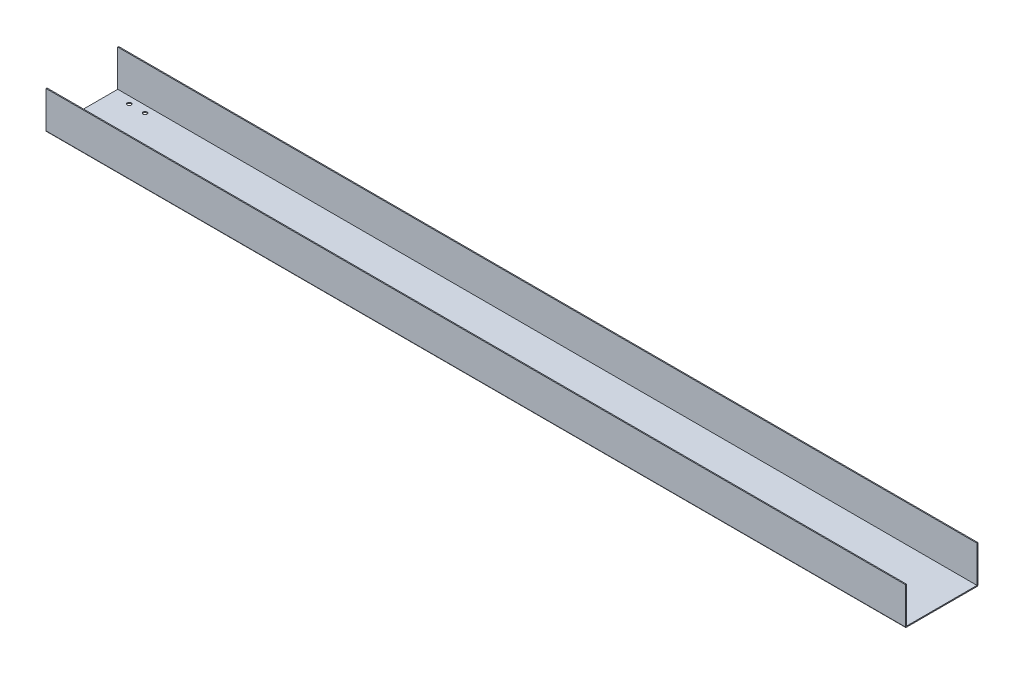
ISO-10303-21;
HEADER;
FILE_DESCRIPTION(('STEP AP214'),'2;1');
FILE_NAME('part.step','',(''),(''),'','','');
FILE_SCHEMA(('AUTOMOTIVE_DESIGN { 1 0 10303 214 1 1 1 1 }'));
ENDSEC;
DATA;
#1=APPLICATION_CONTEXT('core data for automotive mechanical design processes');
#2=APPLICATION_PROTOCOL_DEFINITION('international standard','automotive_design',2000,#1);
#3=PRODUCT_CONTEXT('',#1,'mechanical');
#4=PRODUCT('Part','Part','',(#3));
#5=PRODUCT_RELATED_PRODUCT_CATEGORY('part','',(#4));
#6=PRODUCT_DEFINITION_FORMATION('','',#4);
#7=PRODUCT_DEFINITION_CONTEXT('part definition',#1,'design');
#8=PRODUCT_DEFINITION('design','',#6,#7);
#9=PRODUCT_DEFINITION_SHAPE('','',#8);
#10=(LENGTH_UNIT() NAMED_UNIT(*) SI_UNIT(.MILLI.,.METRE.));
#11=(NAMED_UNIT(*) PLANE_ANGLE_UNIT() SI_UNIT($,.RADIAN.));
#12=(NAMED_UNIT(*) SI_UNIT($,.STERADIAN.) SOLID_ANGLE_UNIT());
#13=UNCERTAINTY_MEASURE_WITH_UNIT(LENGTH_MEASURE(1.E-05),#10,'distance_accuracy_value','');
#14=(GEOMETRIC_REPRESENTATION_CONTEXT(3) GLOBAL_UNCERTAINTY_ASSIGNED_CONTEXT((#13)) GLOBAL_UNIT_ASSIGNED_CONTEXT((#10,
#11,#12)) REPRESENTATION_CONTEXT('',''));
#15=CARTESIAN_POINT('',(0.,0.,0.));
#16=DIRECTION('',(0.,0.,1.));
#17=DIRECTION('',(1.,0.,0.));
#18=AXIS2_PLACEMENT_3D('',#15,#16,#17);
#19=CARTESIAN_POINT('',(-592.530487804878,-1.5,-96.6082317073171));
#20=DIRECTION('',(-1.,0.,0.));
#21=DIRECTION('',(0.,0.,1.));
#22=AXIS2_PLACEMENT_3D('',#19,#20,#21);
#23=PLANE('',#22);
#24=DIRECTION('',(0.,0.,1.));
#25=VECTOR('',#24,1.);
#26=CARTESIAN_POINT('',(-592.530487804878,-1.5,-96.6082317073171));
#27=LINE('',#26,#25);
#28=CARTESIAN_POINT('',(-592.530487804878,-1.5,-40.1082317073171));
#29=VERTEX_POINT('',#28);
#30=CARTESIAN_POINT('',(-592.530487804878,-1.5,66.891768292683));
#31=VERTEX_POINT('',#30);
#32=EDGE_CURVE('E216',#29,#31,#27,.T.);
#33=ORIENTED_EDGE('',*,*,#32,.T.);
#34=DIRECTION('',(0.,1.,0.));
#35=VECTOR('',#34,1.);
#36=CARTESIAN_POINT('',(-592.530487804878,-1.49999999999999,66.891768292683));
#37=LINE('',#36,#35);
#38=CARTESIAN_POINT('',(-592.530487804878,0.,66.891768292683));
#39=VERTEX_POINT('',#38);
#40=EDGE_CURVE('E210',#31,#39,#37,.T.);
#41=ORIENTED_EDGE('',*,*,#40,.T.);
#42=DIRECTION('',(0.,0.,1.));
#43=VECTOR('',#42,1.);
#44=CARTESIAN_POINT('',(-592.530487804878,0.,-96.6082317073171));
#45=LINE('',#44,#43);
#46=CARTESIAN_POINT('',(-592.530487804878,0.,-40.1082317073171));
#47=VERTEX_POINT('',#46);
#48=EDGE_CURVE('E195',#47,#39,#45,.T.);
#49=ORIENTED_EDGE('',*,*,#48,.F.);
#50=DIRECTION('',(0.,-1.,0.));
#51=VECTOR('',#50,1.);
#52=CARTESIAN_POINT('',(-592.530487804878,-1.5,-40.1082317073171));
#53=LINE('',#52,#51);
#54=EDGE_CURVE('E204',#47,#29,#53,.T.);
#55=ORIENTED_EDGE('',*,*,#54,.T.);
#56=EDGE_LOOP('',(#33,#41,#49,#55));
#57=FACE_BOUND('',#56,.T.);
#58=ADVANCED_FACE('F46',(#57),#23,.T.);
#59=CARTESIAN_POINT('',(707.469512195122,-1.5,-96.6082317073171));
#60=DIRECTION('',(1.,0.,0.));
#61=DIRECTION('',(0.,0.,-1.));
#62=AXIS2_PLACEMENT_3D('',#59,#60,#61);
#63=PLANE('',#62);
#64=DIRECTION('',(0.,0.,-1.));
#65=VECTOR('',#64,1.);
#66=CARTESIAN_POINT('',(707.469512195122,0.,-96.6082317073171));
#67=LINE('',#66,#65);
#68=CARTESIAN_POINT('',(707.469512195122,0.,66.8917682926829));
#69=VERTEX_POINT('',#68);
#70=CARTESIAN_POINT('',(707.469512195122,0.,-40.1082317073171));
#71=VERTEX_POINT('',#70);
#72=EDGE_CURVE('E219',#69,#71,#67,.T.);
#73=ORIENTED_EDGE('',*,*,#72,.F.);
#74=DIRECTION('',(0.,-1.,0.));
#75=VECTOR('',#74,1.);
#76=CARTESIAN_POINT('',(707.469512195122,-1.49999999999999,66.8917682926829));
#77=LINE('',#76,#75);
#78=CARTESIAN_POINT('',(707.469512195122,-1.5,66.891768292683));
#79=VERTEX_POINT('',#78);
#80=EDGE_CURVE('E12',#69,#79,#77,.T.);
#81=ORIENTED_EDGE('',*,*,#80,.T.);
#82=DIRECTION('',(0.,0.,-1.));
#83=VECTOR('',#82,1.);
#84=CARTESIAN_POINT('',(707.469512195122,-1.5,-96.6082317073171));
#85=LINE('',#84,#83);
#86=CARTESIAN_POINT('',(707.469512195122,-1.5,-40.1082317073171));
#87=VERTEX_POINT('',#86);
#88=EDGE_CURVE('E200',#79,#87,#85,.T.);
#89=ORIENTED_EDGE('',*,*,#88,.T.);
#90=DIRECTION('',(0.,1.,0.));
#91=VECTOR('',#90,1.);
#92=CARTESIAN_POINT('',(707.469512195122,-1.5,-40.1082317073171));
#93=LINE('',#92,#91);
#94=EDGE_CURVE('E199',#87,#71,#93,.T.);
#95=ORIENTED_EDGE('',*,*,#94,.T.);
#96=EDGE_LOOP('',(#73,#81,#89,#95));
#97=FACE_BOUND('',#96,.T.);
#98=ADVANCED_FACE('F48',(#97),#63,.T.);
#99=CARTESIAN_POINT('',(0.,0.,0.));
#100=DIRECTION('',(0.,1.,0.));
#101=DIRECTION('',(0.,0.,1.));
#102=AXIS2_PLACEMENT_3D('',#99,#100,#101);
#103=PLANE('',#102);
#104=CARTESIAN_POINT('',(-564.580402517152,0.,-29.608231707317));
#105=DIRECTION('',(0.,1.,0.));
#106=DIRECTION('',(0.,0.,1.));
#107=AXIS2_PLACEMENT_3D('',#104,#105,#106);
#108=CIRCLE('',#107,3.00000000000005);
#109=CARTESIAN_POINT('',(-564.580402517152,0.,-26.6082317073169));
#110=VERTEX_POINT('',#109);
#111=EDGE_CURVE('E242',#110,#110,#108,.T.);
#112=ORIENTED_EDGE('',*,*,#111,.F.);
#113=EDGE_LOOP('',(#112));
#114=FACE_BOUND('',#113,.T.);
#115=CARTESIAN_POINT('',(-540.580402517152,0.,-29.608231707317));
#116=DIRECTION('',(0.,1.,0.));
#117=DIRECTION('',(0.,0.,1.));
#118=AXIS2_PLACEMENT_3D('',#115,#116,#117);
#119=CIRCLE('',#118,3.00000000000005);
#120=CARTESIAN_POINT('',(-540.580402517152,0.,-26.6082317073169));
#121=VERTEX_POINT('',#120);
#122=EDGE_CURVE('E232',#121,#121,#119,.T.);
#123=ORIENTED_EDGE('',*,*,#122,.F.);
#124=EDGE_LOOP('',(#123));
#125=FACE_BOUND('',#124,.T.);
#126=CARTESIAN_POINT('',(-540.580402517151,0.,56.391768292683));
#127=DIRECTION('',(0.,1.,0.));
#128=DIRECTION('',(0.,0.,1.));
#129=AXIS2_PLACEMENT_3D('',#126,#127,#128);
#130=CIRCLE('',#129,3.00000000000005);
#131=CARTESIAN_POINT('',(-540.580402517151,0.,59.3917682926831));
#132=VERTEX_POINT('',#131);
#133=EDGE_CURVE('E229',#132,#132,#130,.T.);
#134=ORIENTED_EDGE('',*,*,#133,.F.);
#135=EDGE_LOOP('',(#134));
#136=FACE_BOUND('',#135,.T.);
#137=CARTESIAN_POINT('',(-564.580402517151,0.,56.391768292683));
#138=DIRECTION('',(0.,1.,0.));
#139=DIRECTION('',(0.,0.,1.));
#140=AXIS2_PLACEMENT_3D('',#137,#138,#139);
#141=CIRCLE('',#140,3.00000000000005);
#142=CARTESIAN_POINT('',(-564.580402517151,0.,59.3917682926831));
#143=VERTEX_POINT('',#142);
#144=EDGE_CURVE('E226',#143,#143,#141,.T.);
#145=ORIENTED_EDGE('',*,*,#144,.F.);
#146=EDGE_LOOP('',(#145));
#147=FACE_BOUND('',#146,.T.);
#148=ORIENTED_EDGE('',*,*,#48,.T.);
#149=DIRECTION('',(1.,0.,0.));
#150=VECTOR('',#149,1.);
#151=CARTESIAN_POINT('',(0.,0.,66.891768292683));
#152=LINE('',#151,#150);
#153=EDGE_CURVE('E207',#39,#69,#152,.T.);
#154=ORIENTED_EDGE('',*,*,#153,.T.);
#155=ORIENTED_EDGE('',*,*,#72,.T.);
#156=DIRECTION('',(-1.,0.,0.));
#157=VECTOR('',#156,1.);
#158=CARTESIAN_POINT('',(0.,0.,-40.1082317073171));
#159=LINE('',#158,#157);
#160=EDGE_CURVE('E196',#71,#47,#159,.T.);
#161=ORIENTED_EDGE('',*,*,#160,.T.);
#162=EDGE_LOOP('',(#148,#154,#155,#161));
#163=FACE_BOUND('',#162,.T.);
#164=ADVANCED_FACE('F271',(#114,#125,#136,#147,#163),#103,.T.);
#165=CARTESIAN_POINT('',(0.,-1.5,0.));
#166=DIRECTION('',(0.,1.,0.));
#167=DIRECTION('',(0.,0.,1.));
#168=AXIS2_PLACEMENT_3D('',#165,#166,#167);
#169=PLANE('',#168);
#170=CARTESIAN_POINT('',(-564.580402517152,-1.5,-29.608231707317));
#171=DIRECTION('',(0.,1.,0.));
#172=DIRECTION('',(0.,0.,1.));
#173=AXIS2_PLACEMENT_3D('',#170,#171,#172);
#174=CIRCLE('',#173,3.00000000000005);
#175=CARTESIAN_POINT('',(-564.580402517152,-1.5,-26.6082317073169));
#176=VERTEX_POINT('',#175);
#177=EDGE_CURVE('E50',#176,#176,#174,.T.);
#178=ORIENTED_EDGE('',*,*,#177,.T.);
#179=EDGE_LOOP('',(#178));
#180=FACE_BOUND('',#179,.T.);
#181=CARTESIAN_POINT('',(-540.580402517152,-1.5,-29.608231707317));
#182=DIRECTION('',(0.,1.,0.));
#183=DIRECTION('',(0.,0.,1.));
#184=AXIS2_PLACEMENT_3D('',#181,#182,#183);
#185=CIRCLE('',#184,3.00000000000005);
#186=CARTESIAN_POINT('',(-540.580402517152,-1.5,-26.6082317073169));
#187=VERTEX_POINT('',#186);
#188=EDGE_CURVE('E230',#187,#187,#185,.T.);
#189=ORIENTED_EDGE('',*,*,#188,.T.);
#190=EDGE_LOOP('',(#189));
#191=FACE_BOUND('',#190,.T.);
#192=CARTESIAN_POINT('',(-540.580402517151,-1.5,56.391768292683));
#193=DIRECTION('',(0.,1.,0.));
#194=DIRECTION('',(0.,0.,1.));
#195=AXIS2_PLACEMENT_3D('',#192,#193,#194);
#196=CIRCLE('',#195,3.00000000000005);
#197=CARTESIAN_POINT('',(-540.580402517151,-1.5,59.3917682926831));
#198=VERTEX_POINT('',#197);
#199=EDGE_CURVE('E227',#198,#198,#196,.T.);
#200=ORIENTED_EDGE('',*,*,#199,.T.);
#201=EDGE_LOOP('',(#200));
#202=FACE_BOUND('',#201,.T.);
#203=CARTESIAN_POINT('',(-564.580402517151,-1.5,56.391768292683));
#204=DIRECTION('',(0.,1.,0.));
#205=DIRECTION('',(0.,0.,1.));
#206=AXIS2_PLACEMENT_3D('',#203,#204,#205);
#207=CIRCLE('',#206,3.00000000000005);
#208=CARTESIAN_POINT('',(-564.580402517151,-1.5,59.3917682926831));
#209=VERTEX_POINT('',#208);
#210=EDGE_CURVE('E159',#209,#209,#207,.T.);
#211=ORIENTED_EDGE('',*,*,#210,.T.);
#212=EDGE_LOOP('',(#211));
#213=FACE_BOUND('',#212,.T.);
#214=DIRECTION('',(1.,0.,0.));
#215=VECTOR('',#214,1.);
#216=CARTESIAN_POINT('',(0.,-1.5,66.891768292683));
#217=LINE('',#216,#215);
#218=EDGE_CURVE('E55',#31,#79,#217,.T.);
#219=ORIENTED_EDGE('',*,*,#218,.F.);
#220=ORIENTED_EDGE('',*,*,#32,.F.);
#221=DIRECTION('',(-1.,0.,0.));
#222=VECTOR('',#221,1.);
#223=CARTESIAN_POINT('',(0.,-1.5,-40.1082317073171));
#224=LINE('',#223,#222);
#225=EDGE_CURVE('E70',#87,#29,#224,.T.);
#226=ORIENTED_EDGE('',*,*,#225,.F.);
#227=ORIENTED_EDGE('',*,*,#88,.F.);
#228=EDGE_LOOP('',(#219,#220,#226,#227));
#229=FACE_BOUND('',#228,.T.);
#230=ADVANCED_FACE('F292',(#180,#191,#202,#213,#229),#169,.F.);
#231=CARTESIAN_POINT('',(707.469512195122,0.,-41.6082317073171));
#232=DIRECTION('',(1.,0.,0.));
#233=DIRECTION('',(0.,0.,-1.));
#234=AXIS2_PLACEMENT_3D('',#231,#232,#233);
#235=PLANE('',#234);
#236=CARTESIAN_POINT('',(707.469512195122,0.,-40.1082317073171));
#237=DIRECTION('',(-1.,0.,0.));
#238=DIRECTION('',(0.,0.,1.));
#239=AXIS2_PLACEMENT_3D('',#236,#237,#238);
#240=CIRCLE('',#239,1.5);
#241=CARTESIAN_POINT('',(707.469512195122,0.,-41.6082317073171));
#242=VERTEX_POINT('',#241);
#243=EDGE_CURVE('E193',#242,#87,#240,.T.);
#244=ORIENTED_EDGE('',*,*,#243,.F.);
#245=DIRECTION('',(0.,0.,1.));
#246=VECTOR('',#245,1.);
#247=CARTESIAN_POINT('',(707.469512195122,0.,-41.6082317073171));
#248=LINE('',#247,#246);
#249=EDGE_CURVE('E187',#242,#71,#248,.T.);
#250=ORIENTED_EDGE('',*,*,#249,.T.);
#251=ORIENTED_EDGE('',*,*,#94,.F.);
#252=EDGE_LOOP('',(#244,#250,#251));
#253=FACE_BOUND('',#252,.T.);
#254=ADVANCED_FACE('F276',(#253),#235,.T.);
#255=CARTESIAN_POINT('',(-592.530487804878,0.,-40.1082317073171));
#256=DIRECTION('',(-1.,0.,0.));
#257=DIRECTION('',(0.,0.,1.));
#258=AXIS2_PLACEMENT_3D('',#255,#256,#257);
#259=CYLINDRICAL_SURFACE('',#258,1.5);
#260=CARTESIAN_POINT('',(-592.530487804878,0.,-40.1082317073171));
#261=DIRECTION('',(-1.,0.,0.));
#262=DIRECTION('',(0.,0.,1.));
#263=AXIS2_PLACEMENT_3D('',#260,#261,#262);
#264=CIRCLE('',#263,1.5);
#265=CARTESIAN_POINT('',(-592.530487804878,0.,-41.6082317073171));
#266=VERTEX_POINT('',#265);
#267=EDGE_CURVE('E166',#266,#29,#264,.T.);
#268=ORIENTED_EDGE('',*,*,#267,.F.);
#269=DIRECTION('',(-1.,0.,0.));
#270=VECTOR('',#269,1.);
#271=CARTESIAN_POINT('',(0.,0.,-41.6082317073171));
#272=LINE('',#271,#270);
#273=EDGE_CURVE('E167',#242,#266,#272,.T.);
#274=ORIENTED_EDGE('',*,*,#273,.F.);
#275=ORIENTED_EDGE('',*,*,#243,.T.);
#276=ORIENTED_EDGE('',*,*,#225,.T.);
#277=EDGE_LOOP('',(#268,#274,#275,#276));
#278=FACE_BOUND('',#277,.T.);
#279=ADVANCED_FACE('F299',(#278),#259,.T.);
#280=CARTESIAN_POINT('',(-592.530487804878,0.,-41.6082317073171));
#281=DIRECTION('',(-1.,0.,0.));
#282=DIRECTION('',(0.,0.,1.));
#283=AXIS2_PLACEMENT_3D('',#280,#281,#282);
#284=PLANE('',#283);
#285=DIRECTION('',(0.,0.,-1.));
#286=VECTOR('',#285,1.);
#287=CARTESIAN_POINT('',(-592.530487804878,0.,-41.6082317073171));
#288=LINE('',#287,#286);
#289=EDGE_CURVE('E163',#47,#266,#288,.T.);
#290=ORIENTED_EDGE('',*,*,#289,.T.);
#291=ORIENTED_EDGE('',*,*,#267,.T.);
#292=ORIENTED_EDGE('',*,*,#54,.F.);
#293=EDGE_LOOP('',(#290,#291,#292));
#294=FACE_BOUND('',#293,.T.);
#295=ADVANCED_FACE('F311',(#294),#284,.T.);
#296=CARTESIAN_POINT('',(-592.530487804878,55.3219027549038,-41.6082317073169));
#297=DIRECTION('',(0.,1.,0.));
#298=DIRECTION('',(-1.,0.,0.));
#299=AXIS2_PLACEMENT_3D('',#296,#297,#298);
#300=PLANE('',#299);
#301=DIRECTION('',(-1.,0.,0.));
#302=VECTOR('',#301,1.);
#303=CARTESIAN_POINT('',(-592.530487804878,55.3219027549038,-40.1082317073169));
#304=LINE('',#303,#302);
#305=CARTESIAN_POINT('',(707.469512195122,55.3219027549038,-40.1082317073169));
#306=VERTEX_POINT('',#305);
#307=CARTESIAN_POINT('',(-592.530487804878,55.3219027549038,-40.1082317073169));
#308=VERTEX_POINT('',#307);
#309=EDGE_CURVE('E177',#306,#308,#304,.T.);
#310=ORIENTED_EDGE('',*,*,#309,.F.);
#311=DIRECTION('',(0.,0.,1.));
#312=VECTOR('',#311,1.);
#313=CARTESIAN_POINT('',(707.469512195122,55.3219027549038,-41.6082317073169));
#314=LINE('',#313,#312);
#315=CARTESIAN_POINT('',(707.469512195122,55.3219027549038,-41.6082317073169));
#316=VERTEX_POINT('',#315);
#317=EDGE_CURVE('E170',#316,#306,#314,.T.);
#318=ORIENTED_EDGE('',*,*,#317,.F.);
#319=DIRECTION('',(-1.,0.,0.));
#320=VECTOR('',#319,1.);
#321=CARTESIAN_POINT('',(-592.530487804878,55.3219027549038,-41.6082317073169));
#322=LINE('',#321,#320);
#323=CARTESIAN_POINT('',(-592.530487804878,55.3219027549038,-41.6082317073169));
#324=VERTEX_POINT('',#323);
#325=EDGE_CURVE('E184',#316,#324,#322,.T.);
#326=ORIENTED_EDGE('',*,*,#325,.T.);
#327=DIRECTION('',(0.,0.,1.));
#328=VECTOR('',#327,1.);
#329=CARTESIAN_POINT('',(-592.530487804878,55.3219027549038,-41.6082317073169));
#330=LINE('',#329,#328);
#331=EDGE_CURVE('E182',#324,#308,#330,.T.);
#332=ORIENTED_EDGE('',*,*,#331,.T.);
#333=EDGE_LOOP('',(#310,#318,#326,#332));
#334=FACE_BOUND('',#333,.T.);
#335=ADVANCED_FACE('F314',(#334),#300,.T.);
#336=CARTESIAN_POINT('',(0.,-41.2863289524133,-40.1082317073172));
#337=DIRECTION('',(0.,0.,1.));
#338=DIRECTION('',(0.,-1.,0.));
#339=AXIS2_PLACEMENT_3D('',#336,#337,#338);
#340=PLANE('',#339);
#341=ORIENTED_EDGE('',*,*,#160,.F.);
#342=DIRECTION('',(0.,1.,0.));
#343=VECTOR('',#342,1.);
#344=CARTESIAN_POINT('',(707.469512195122,55.3219027549038,-40.1082317073169));
#345=LINE('',#344,#343);
#346=EDGE_CURVE('E180',#71,#306,#345,.T.);
#347=ORIENTED_EDGE('',*,*,#346,.T.);
#348=ORIENTED_EDGE('',*,*,#309,.T.);
#349=DIRECTION('',(0.,-1.,0.));
#350=VECTOR('',#349,1.);
#351=CARTESIAN_POINT('',(-592.530487804878,55.3219027549038,-40.1082317073169));
#352=LINE('',#351,#350);
#353=EDGE_CURVE('E175',#308,#47,#352,.T.);
#354=ORIENTED_EDGE('',*,*,#353,.T.);
#355=EDGE_LOOP('',(#341,#347,#348,#354));
#356=FACE_BOUND('',#355,.T.);
#357=ADVANCED_FACE('F285',(#356),#340,.T.);
#358=CARTESIAN_POINT('',(707.469512195122,55.3219027549038,-41.6082317073169));
#359=DIRECTION('',(1.,0.,0.));
#360=DIRECTION('',(0.,1.,0.));
#361=AXIS2_PLACEMENT_3D('',#358,#359,#360);
#362=PLANE('',#361);
#363=ORIENTED_EDGE('',*,*,#249,.F.);
#364=DIRECTION('',(0.,1.,0.));
#365=VECTOR('',#364,1.);
#366=CARTESIAN_POINT('',(707.469512195122,55.3219027549038,-41.6082317073169));
#367=LINE('',#366,#365);
#368=EDGE_CURVE('E173',#242,#316,#367,.T.);
#369=ORIENTED_EDGE('',*,*,#368,.T.);
#370=ORIENTED_EDGE('',*,*,#317,.T.);
#371=ORIENTED_EDGE('',*,*,#346,.F.);
#372=EDGE_LOOP('',(#363,#369,#370,#371));
#373=FACE_BOUND('',#372,.T.);
#374=ADVANCED_FACE('F280',(#373),#362,.T.);
#375=CARTESIAN_POINT('',(0.,-41.2863289524133,-41.6082317073173));
#376=DIRECTION('',(0.,0.,1.));
#377=DIRECTION('',(0.,-1.,0.));
#378=AXIS2_PLACEMENT_3D('',#375,#376,#377);
#379=PLANE('',#378);
#380=ORIENTED_EDGE('',*,*,#368,.F.);
#381=ORIENTED_EDGE('',*,*,#273,.T.);
#382=DIRECTION('',(0.,-1.,0.));
#383=VECTOR('',#382,1.);
#384=CARTESIAN_POINT('',(-592.530487804878,55.3219027549038,-41.6082317073169));
#385=LINE('',#384,#383);
#386=EDGE_CURVE('E164',#324,#266,#385,.T.);
#387=ORIENTED_EDGE('',*,*,#386,.F.);
#388=ORIENTED_EDGE('',*,*,#325,.F.);
#389=EDGE_LOOP('',(#380,#381,#387,#388));
#390=FACE_BOUND('',#389,.T.);
#391=ADVANCED_FACE('F319',(#390),#379,.F.);
#392=CARTESIAN_POINT('',(-592.530487804878,55.3219027549038,-41.6082317073169));
#393=DIRECTION('',(-1.,0.,0.));
#394=DIRECTION('',(0.,-1.,0.));
#395=AXIS2_PLACEMENT_3D('',#392,#393,#394);
#396=PLANE('',#395);
#397=ORIENTED_EDGE('',*,*,#289,.F.);
#398=ORIENTED_EDGE('',*,*,#353,.F.);
#399=ORIENTED_EDGE('',*,*,#331,.F.);
#400=ORIENTED_EDGE('',*,*,#386,.T.);
#401=EDGE_LOOP('',(#397,#398,#399,#400));
#402=FACE_BOUND('',#401,.T.);
#403=ADVANCED_FACE('F316',(#402),#396,.T.);
#404=CARTESIAN_POINT('',(-592.530487804878,0.,68.391768292683));
#405=DIRECTION('',(-1.,0.,0.));
#406=DIRECTION('',(0.,0.,1.));
#407=AXIS2_PLACEMENT_3D('',#404,#405,#406);
#408=PLANE('',#407);
#409=CARTESIAN_POINT('',(-592.530487804878,0.,66.891768292683));
#410=DIRECTION('',(1.,0.,0.));
#411=DIRECTION('',(0.,0.,-1.));
#412=AXIS2_PLACEMENT_3D('',#409,#410,#411);
#413=CIRCLE('',#412,1.49999999999999);
#414=CARTESIAN_POINT('',(-592.530487804878,0.,68.391768292683));
#415=VERTEX_POINT('',#414);
#416=EDGE_CURVE('E161',#415,#31,#413,.T.);
#417=ORIENTED_EDGE('',*,*,#416,.F.);
#418=DIRECTION('',(0.,0.,-1.));
#419=VECTOR('',#418,1.);
#420=CARTESIAN_POINT('',(-592.530487804878,0.,68.391768292683));
#421=LINE('',#420,#419);
#422=EDGE_CURVE('E150',#415,#39,#421,.T.);
#423=ORIENTED_EDGE('',*,*,#422,.T.);
#424=ORIENTED_EDGE('',*,*,#40,.F.);
#425=EDGE_LOOP('',(#417,#423,#424));
#426=FACE_BOUND('',#425,.T.);
#427=ADVANCED_FACE('F262',(#426),#408,.T.);
#428=CARTESIAN_POINT('',(707.469512195122,0.,66.8917682926829));
#429=DIRECTION('',(1.,0.,0.));
#430=DIRECTION('',(0.,0.,-1.));
#431=AXIS2_PLACEMENT_3D('',#428,#429,#430);
#432=CYLINDRICAL_SURFACE('',#431,1.49999999999999);
#433=CARTESIAN_POINT('',(707.469512195122,0.,66.8917682926829));
#434=DIRECTION('',(1.,0.,0.));
#435=DIRECTION('',(0.,0.,-1.));
#436=AXIS2_PLACEMENT_3D('',#433,#434,#435);
#437=CIRCLE('',#436,1.49999999999999);
#438=CARTESIAN_POINT('',(707.469512195122,0.,68.3917682926829));
#439=VERTEX_POINT('',#438);
#440=EDGE_CURVE('E144',#439,#79,#437,.T.);
#441=ORIENTED_EDGE('',*,*,#440,.F.);
#442=DIRECTION('',(1.,0.,0.));
#443=VECTOR('',#442,1.);
#444=CARTESIAN_POINT('',(0.,0.,68.391768292683));
#445=LINE('',#444,#443);
#446=EDGE_CURVE('E143',#415,#439,#445,.T.);
#447=ORIENTED_EDGE('',*,*,#446,.F.);
#448=ORIENTED_EDGE('',*,*,#416,.T.);
#449=ORIENTED_EDGE('',*,*,#218,.T.);
#450=EDGE_LOOP('',(#441,#447,#448,#449));
#451=FACE_BOUND('',#450,.T.);
#452=ADVANCED_FACE('F263',(#451),#432,.T.);
#453=CARTESIAN_POINT('',(707.469512195122,0.,68.3917682926829));
#454=DIRECTION('',(1.,0.,0.));
#455=DIRECTION('',(0.,0.,-1.));
#456=AXIS2_PLACEMENT_3D('',#453,#454,#455);
#457=PLANE('',#456);
#458=DIRECTION('',(0.,0.,1.));
#459=VECTOR('',#458,1.);
#460=CARTESIAN_POINT('',(707.469512195122,0.,68.3917682926829));
#461=LINE('',#460,#459);
#462=EDGE_CURVE('E153',#69,#439,#461,.T.);
#463=ORIENTED_EDGE('',*,*,#462,.T.);
#464=ORIENTED_EDGE('',*,*,#440,.T.);
#465=ORIENTED_EDGE('',*,*,#80,.F.);
#466=EDGE_LOOP('',(#463,#464,#465));
#467=FACE_BOUND('',#466,.T.);
#468=ADVANCED_FACE('F267',(#467),#457,.T.);
#469=CARTESIAN_POINT('',(-592.530487804878,55.3219027549037,68.3917682926828));
#470=DIRECTION('',(0.,1.,0.));
#471=DIRECTION('',(1.,0.,0.));
#472=AXIS2_PLACEMENT_3D('',#469,#470,#471);
#473=PLANE('',#472);
#474=DIRECTION('',(1.,0.,0.));
#475=VECTOR('',#474,1.);
#476=CARTESIAN_POINT('',(-592.530487804878,55.3219027549037,66.8917682926829));
#477=LINE('',#476,#475);
#478=CARTESIAN_POINT('',(-592.530487804878,55.3219027549037,66.8917682926829));
#479=VERTEX_POINT('',#478);
#480=CARTESIAN_POINT('',(707.469512195122,55.3219027549038,66.8917682926827));
#481=VERTEX_POINT('',#480);
#482=EDGE_CURVE('E252',#479,#481,#477,.T.);
#483=ORIENTED_EDGE('',*,*,#482,.F.);
#484=DIRECTION('',(0.,0.,-1.));
#485=VECTOR('',#484,1.);
#486=CARTESIAN_POINT('',(-592.530487804878,55.3219027549037,68.3917682926828));
#487=LINE('',#486,#485);
#488=CARTESIAN_POINT('',(-592.530487804878,55.3219027549037,68.3917682926828));
#489=VERTEX_POINT('',#488);
#490=EDGE_CURVE('E149',#489,#479,#487,.T.);
#491=ORIENTED_EDGE('',*,*,#490,.F.);
#492=DIRECTION('',(1.,0.,0.));
#493=VECTOR('',#492,1.);
#494=CARTESIAN_POINT('',(-592.530487804878,55.3219027549037,68.3917682926828));
#495=LINE('',#494,#493);
#496=CARTESIAN_POINT('',(707.469512195122,55.3219027549038,68.3917682926827));
#497=VERTEX_POINT('',#496);
#498=EDGE_CURVE('E137',#489,#497,#495,.T.);
#499=ORIENTED_EDGE('',*,*,#498,.T.);
#500=DIRECTION('',(0.,0.,-1.));
#501=VECTOR('',#500,1.);
#502=CARTESIAN_POINT('',(707.469512195122,55.3219027549038,68.3917682926827));
#503=LINE('',#502,#501);
#504=EDGE_CURVE('E125',#497,#481,#503,.T.);
#505=ORIENTED_EDGE('',*,*,#504,.T.);
#506=EDGE_LOOP('',(#483,#491,#499,#505));
#507=FACE_BOUND('',#506,.T.);
#508=ADVANCED_FACE('F147',(#507),#473,.T.);
#509=CARTESIAN_POINT('',(0.,-68.0698655377792,66.8917682926832));
#510=DIRECTION('',(0.,0.,-1.));
#511=DIRECTION('',(0.,1.,0.));
#512=AXIS2_PLACEMENT_3D('',#509,#510,#511);
#513=PLANE('',#512);
#514=ORIENTED_EDGE('',*,*,#153,.F.);
#515=DIRECTION('',(0.,1.,0.));
#516=VECTOR('',#515,1.);
#517=CARTESIAN_POINT('',(-592.530487804878,-164.678097245096,66.8917682926836));
#518=LINE('',#517,#516);
#519=EDGE_CURVE('E136',#39,#479,#518,.T.);
#520=ORIENTED_EDGE('',*,*,#519,.T.);
#521=ORIENTED_EDGE('',*,*,#482,.T.);
#522=DIRECTION('',(0.,-1.,0.));
#523=VECTOR('',#522,1.);
#524=CARTESIAN_POINT('',(707.469512195122,-164.678097245096,66.8917682926835));
#525=LINE('',#524,#523);
#526=EDGE_CURVE('E131',#481,#69,#525,.T.);
#527=ORIENTED_EDGE('',*,*,#526,.T.);
#528=EDGE_LOOP('',(#514,#520,#521,#527));
#529=FACE_BOUND('',#528,.T.);
#530=ADVANCED_FACE('F255',(#529),#513,.T.);
#531=CARTESIAN_POINT('',(-592.530487804878,-164.678097245096,68.3917682926836));
#532=DIRECTION('',(-1.,0.,0.));
#533=DIRECTION('',(0.,1.,0.));
#534=AXIS2_PLACEMENT_3D('',#531,#532,#533);
#535=PLANE('',#534);
#536=ORIENTED_EDGE('',*,*,#422,.F.);
#537=DIRECTION('',(0.,1.,0.));
#538=VECTOR('',#537,1.);
#539=CARTESIAN_POINT('',(-592.530487804878,-164.678097245096,68.3917682926836));
#540=LINE('',#539,#538);
#541=EDGE_CURVE('E249',#415,#489,#540,.T.);
#542=ORIENTED_EDGE('',*,*,#541,.T.);
#543=ORIENTED_EDGE('',*,*,#490,.T.);
#544=ORIENTED_EDGE('',*,*,#519,.F.);
#545=EDGE_LOOP('',(#536,#542,#543,#544));
#546=FACE_BOUND('',#545,.T.);
#547=ADVANCED_FACE('F258',(#546),#535,.T.);
#548=CARTESIAN_POINT('',(0.,-68.0698655377792,68.3917682926832));
#549=DIRECTION('',(0.,0.,-1.));
#550=DIRECTION('',(0.,1.,0.));
#551=AXIS2_PLACEMENT_3D('',#548,#549,#550);
#552=PLANE('',#551);
#553=ORIENTED_EDGE('',*,*,#541,.F.);
#554=ORIENTED_EDGE('',*,*,#446,.T.);
#555=DIRECTION('',(0.,-1.,0.));
#556=VECTOR('',#555,1.);
#557=CARTESIAN_POINT('',(707.469512195122,-164.678097245096,68.3917682926835));
#558=LINE('',#557,#556);
#559=EDGE_CURVE('E129',#497,#439,#558,.T.);
#560=ORIENTED_EDGE('',*,*,#559,.F.);
#561=ORIENTED_EDGE('',*,*,#498,.F.);
#562=EDGE_LOOP('',(#553,#554,#560,#561));
#563=FACE_BOUND('',#562,.T.);
#564=ADVANCED_FACE('F141',(#563),#552,.F.);
#565=CARTESIAN_POINT('',(707.469512195122,-164.678097245096,68.3917682926835));
#566=DIRECTION('',(1.,0.,0.));
#567=DIRECTION('',(0.,-1.,0.));
#568=AXIS2_PLACEMENT_3D('',#565,#566,#567);
#569=PLANE('',#568);
#570=ORIENTED_EDGE('',*,*,#462,.F.);
#571=ORIENTED_EDGE('',*,*,#526,.F.);
#572=ORIENTED_EDGE('',*,*,#504,.F.);
#573=ORIENTED_EDGE('',*,*,#559,.T.);
#574=EDGE_LOOP('',(#570,#571,#572,#573));
#575=FACE_BOUND('',#574,.T.);
#576=ADVANCED_FACE('F128',(#575),#569,.T.);
#577=CARTESIAN_POINT('',(-564.580402517151,-10.,56.391768292683));
#578=DIRECTION('',(0.,1.,0.));
#579=DIRECTION('',(0.,0.,1.));
#580=AXIS2_PLACEMENT_3D('',#577,#578,#579);
#581=CYLINDRICAL_SURFACE('',#580,3.00000000000005);
#582=ORIENTED_EDGE('',*,*,#144,.T.);
#583=EDGE_LOOP('',(#582));
#584=FACE_BOUND('',#583,.T.);
#585=ORIENTED_EDGE('',*,*,#210,.F.);
#586=EDGE_LOOP('',(#585));
#587=FACE_BOUND('',#586,.T.);
#588=ADVANCED_FACE('F339',(#584,#587),#581,.F.);
#589=CARTESIAN_POINT('',(-540.580402517151,-10.,56.391768292683));
#590=DIRECTION('',(0.,1.,0.));
#591=DIRECTION('',(0.,0.,1.));
#592=AXIS2_PLACEMENT_3D('',#589,#590,#591);
#593=CYLINDRICAL_SURFACE('',#592,3.00000000000005);
#594=ORIENTED_EDGE('',*,*,#133,.T.);
#595=EDGE_LOOP('',(#594));
#596=FACE_BOUND('',#595,.T.);
#597=ORIENTED_EDGE('',*,*,#199,.F.);
#598=EDGE_LOOP('',(#597));
#599=FACE_BOUND('',#598,.T.);
#600=ADVANCED_FACE('F350',(#596,#599),#593,.F.);
#601=CARTESIAN_POINT('',(-540.580402517152,-10.,-29.608231707317));
#602=DIRECTION('',(0.,1.,0.));
#603=DIRECTION('',(0.,0.,1.));
#604=AXIS2_PLACEMENT_3D('',#601,#602,#603);
#605=CYLINDRICAL_SURFACE('',#604,3.00000000000005);
#606=ORIENTED_EDGE('',*,*,#122,.T.);
#607=EDGE_LOOP('',(#606));
#608=FACE_BOUND('',#607,.T.);
#609=ORIENTED_EDGE('',*,*,#188,.F.);
#610=EDGE_LOOP('',(#609));
#611=FACE_BOUND('',#610,.T.);
#612=ADVANCED_FACE('F354',(#608,#611),#605,.F.);
#613=CARTESIAN_POINT('',(-564.580402517152,-10.,-29.608231707317));
#614=DIRECTION('',(0.,1.,0.));
#615=DIRECTION('',(0.,0.,1.));
#616=AXIS2_PLACEMENT_3D('',#613,#614,#615);
#617=CYLINDRICAL_SURFACE('',#616,3.00000000000005);
#618=ORIENTED_EDGE('',*,*,#111,.T.);
#619=EDGE_LOOP('',(#618));
#620=FACE_BOUND('',#619,.T.);
#621=ORIENTED_EDGE('',*,*,#177,.F.);
#622=EDGE_LOOP('',(#621));
#623=FACE_BOUND('',#622,.T.);
#624=ADVANCED_FACE('F358',(#620,#623),#617,.F.);
#625=CLOSED_SHELL('',(#58,#98,#164,#230,#254,#279,#295,#335,#357,#374,#391,#403,#427,#452,#468,
#508,#530,#547,#564,#576,#588,#600,#612,#624));
#626=MANIFOLD_SOLID_BREP('B2',#625);
#627=ADVANCED_BREP_SHAPE_REPRESENTATION('',(#18,#626),#14);
#628=SHAPE_DEFINITION_REPRESENTATION(#9,#627);
ENDSEC;
END-ISO-10303-21;
